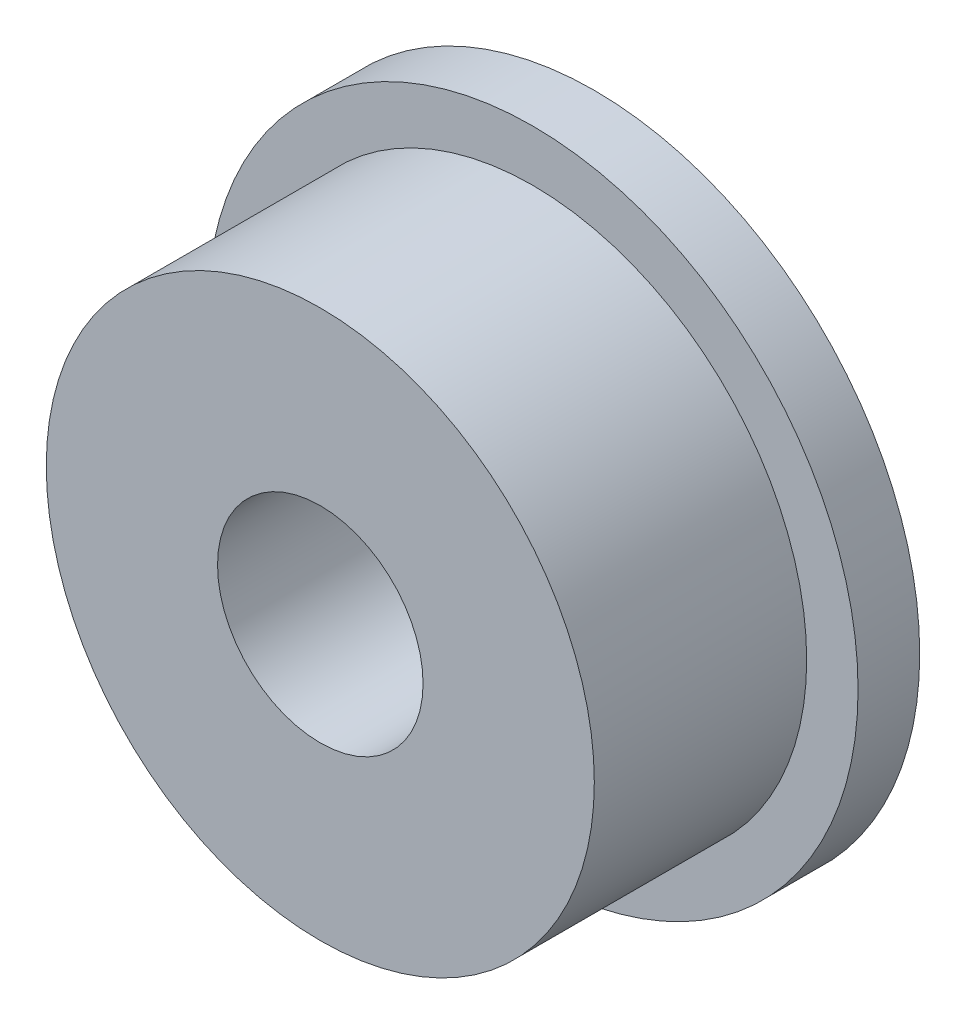
ISO-10303-21;
HEADER;
FILE_DESCRIPTION(('STEP AP214'),'2;1');
FILE_NAME('part.step','',(''),(''),'','','');
FILE_SCHEMA(('AUTOMOTIVE_DESIGN { 1 0 10303 214 1 1 1 1 }'));
ENDSEC;
DATA;
#1=APPLICATION_CONTEXT('core data for automotive mechanical design processes');
#2=APPLICATION_PROTOCOL_DEFINITION('international standard','automotive_design',2000,#1);
#3=PRODUCT_CONTEXT('',#1,'mechanical');
#4=PRODUCT('Part','Part','',(#3));
#5=PRODUCT_RELATED_PRODUCT_CATEGORY('part','',(#4));
#6=PRODUCT_DEFINITION_FORMATION('','',#4);
#7=PRODUCT_DEFINITION_CONTEXT('part definition',#1,'design');
#8=PRODUCT_DEFINITION('design','',#6,#7);
#9=PRODUCT_DEFINITION_SHAPE('','',#8);
#10=(LENGTH_UNIT() NAMED_UNIT(*) SI_UNIT(.MILLI.,.METRE.));
#11=(NAMED_UNIT(*) PLANE_ANGLE_UNIT() SI_UNIT($,.RADIAN.));
#12=(NAMED_UNIT(*) SI_UNIT($,.STERADIAN.) SOLID_ANGLE_UNIT());
#13=UNCERTAINTY_MEASURE_WITH_UNIT(LENGTH_MEASURE(1.E-05),#10,'distance_accuracy_value','');
#14=(GEOMETRIC_REPRESENTATION_CONTEXT(3) GLOBAL_UNCERTAINTY_ASSIGNED_CONTEXT((#13)) GLOBAL_UNIT_ASSIGNED_CONTEXT((#10,
#11,#12)) REPRESENTATION_CONTEXT('',''));
#15=CARTESIAN_POINT('',(0.,0.,0.));
#16=DIRECTION('',(0.,0.,1.));
#17=DIRECTION('',(1.,0.,0.));
#18=AXIS2_PLACEMENT_3D('',#15,#16,#17);
#19=CARTESIAN_POINT('',(0.,0.,1.5));
#20=DIRECTION('',(0.,0.,1.));
#21=DIRECTION('',(1.,0.,0.));
#22=AXIS2_PLACEMENT_3D('',#19,#20,#21);
#23=PLANE('',#22);
#24=CARTESIAN_POINT('',(0.,0.,1.5));
#25=DIRECTION('',(0.,0.,1.));
#26=DIRECTION('',(1.,0.,0.));
#27=AXIS2_PLACEMENT_3D('',#24,#25,#26);
#28=CIRCLE('',#27,4.);
#29=CARTESIAN_POINT('',(4.,0.,1.5));
#30=VERTEX_POINT('',#29);
#31=EDGE_CURVE('E10',#30,#30,#28,.T.);
#32=ORIENTED_EDGE('',*,*,#31,.T.);
#33=EDGE_LOOP('',(#32));
#34=FACE_BOUND('',#33,.T.);
#35=CARTESIAN_POINT('',(0.,0.,1.5));
#36=DIRECTION('',(0.,0.,1.));
#37=DIRECTION('',(1.,0.,0.));
#38=AXIS2_PLACEMENT_3D('',#35,#36,#37);
#39=CIRCLE('',#38,1.5);
#40=CARTESIAN_POINT('',(1.5,0.,1.5));
#41=VERTEX_POINT('',#40);
#42=EDGE_CURVE('E42',#41,#41,#39,.T.);
#43=ORIENTED_EDGE('',*,*,#42,.F.);
#44=EDGE_LOOP('',(#43));
#45=FACE_BOUND('',#44,.T.);
#46=ADVANCED_FACE('F40',(#34,#45),#23,.T.);
#47=CARTESIAN_POINT('',(0.,0.,-2.5));
#48=DIRECTION('',(0.,0.,1.));
#49=DIRECTION('',(1.,0.,0.));
#50=AXIS2_PLACEMENT_3D('',#47,#48,#49);
#51=PLANE('',#50);
#52=CARTESIAN_POINT('',(0.,0.,-2.5));
#53=DIRECTION('',(0.,0.,1.));
#54=DIRECTION('',(1.,0.,0.));
#55=AXIS2_PLACEMENT_3D('',#52,#53,#54);
#56=CIRCLE('',#55,1.5);
#57=CARTESIAN_POINT('',(1.5,0.,-2.5));
#58=VERTEX_POINT('',#57);
#59=EDGE_CURVE('E48',#58,#58,#56,.T.);
#60=ORIENTED_EDGE('',*,*,#59,.T.);
#61=EDGE_LOOP('',(#60));
#62=FACE_BOUND('',#61,.T.);
#63=CARTESIAN_POINT('',(0.,0.,-2.5));
#64=DIRECTION('',(0.,0.,1.));
#65=DIRECTION('',(1.,0.,0.));
#66=AXIS2_PLACEMENT_3D('',#63,#64,#65);
#67=CIRCLE('',#66,4.75);
#68=CARTESIAN_POINT('',(4.75,0.,-2.5));
#69=VERTEX_POINT('',#68);
#70=EDGE_CURVE('E59',#69,#69,#67,.T.);
#71=ORIENTED_EDGE('',*,*,#70,.F.);
#72=EDGE_LOOP('',(#71));
#73=FACE_BOUND('',#72,.T.);
#74=ADVANCED_FACE('F71',(#62,#73),#51,.F.);
#75=CARTESIAN_POINT('',(0.,0.,1.5));
#76=DIRECTION('',(0.,0.,-1.));
#77=DIRECTION('',(-1.,0.,0.));
#78=AXIS2_PLACEMENT_3D('',#75,#76,#77);
#79=CYLINDRICAL_SURFACE('',#78,4.);
#80=CARTESIAN_POINT('',(0.,0.,-1.6));
#81=DIRECTION('',(0.,0.,1.));
#82=DIRECTION('',(1.,0.,0.));
#83=AXIS2_PLACEMENT_3D('',#80,#81,#82);
#84=CIRCLE('',#83,4.);
#85=CARTESIAN_POINT('',(4.,0.,-1.6));
#86=VERTEX_POINT('',#85);
#87=EDGE_CURVE('E52',#86,#86,#84,.T.);
#88=ORIENTED_EDGE('',*,*,#87,.T.);
#89=EDGE_LOOP('',(#88));
#90=FACE_BOUND('',#89,.T.);
#91=ORIENTED_EDGE('',*,*,#31,.F.);
#92=EDGE_LOOP('',(#91));
#93=FACE_BOUND('',#92,.T.);
#94=ADVANCED_FACE('F39',(#90,#93),#79,.T.);
#95=CARTESIAN_POINT('',(0.,0.,1.5));
#96=DIRECTION('',(0.,0.,-1.));
#97=DIRECTION('',(-1.,0.,0.));
#98=AXIS2_PLACEMENT_3D('',#95,#96,#97);
#99=CYLINDRICAL_SURFACE('',#98,1.5);
#100=ORIENTED_EDGE('',*,*,#42,.T.);
#101=EDGE_LOOP('',(#100));
#102=FACE_BOUND('',#101,.T.);
#103=ORIENTED_EDGE('',*,*,#59,.F.);
#104=EDGE_LOOP('',(#103));
#105=FACE_BOUND('',#104,.T.);
#106=ADVANCED_FACE('F79',(#102,#105),#99,.F.);
#107=CARTESIAN_POINT('',(0.,0.,-1.6));
#108=DIRECTION('',(0.,0.,1.));
#109=DIRECTION('',(1.,0.,0.));
#110=AXIS2_PLACEMENT_3D('',#107,#108,#109);
#111=PLANE('',#110);
#112=CARTESIAN_POINT('',(0.,0.,-1.6));
#113=DIRECTION('',(0.,0.,1.));
#114=DIRECTION('',(1.,0.,0.));
#115=AXIS2_PLACEMENT_3D('',#112,#113,#114);
#116=CIRCLE('',#115,4.75);
#117=CARTESIAN_POINT('',(4.75,0.,-1.6));
#118=VERTEX_POINT('',#117);
#119=EDGE_CURVE('E60',#118,#118,#116,.T.);
#120=ORIENTED_EDGE('',*,*,#119,.T.);
#121=EDGE_LOOP('',(#120));
#122=FACE_BOUND('',#121,.T.);
#123=ORIENTED_EDGE('',*,*,#87,.F.);
#124=EDGE_LOOP('',(#123));
#125=FACE_BOUND('',#124,.T.);
#126=ADVANCED_FACE('F63',(#122,#125),#111,.T.);
#127=CARTESIAN_POINT('',(0.,0.,-1.6));
#128=DIRECTION('',(0.,0.,-1.));
#129=DIRECTION('',(-1.,0.,0.));
#130=AXIS2_PLACEMENT_3D('',#127,#128,#129);
#131=CYLINDRICAL_SURFACE('',#130,4.75);
#132=ORIENTED_EDGE('',*,*,#119,.F.);
#133=EDGE_LOOP('',(#132));
#134=FACE_BOUND('',#133,.T.);
#135=ORIENTED_EDGE('',*,*,#70,.T.);
#136=EDGE_LOOP('',(#135));
#137=FACE_BOUND('',#136,.T.);
#138=ADVANCED_FACE('F66',(#134,#137),#131,.T.);
#139=CLOSED_SHELL('',(#46,#74,#94,#106,#126,#138));
#140=MANIFOLD_SOLID_BREP('B2',#139);
#141=ADVANCED_BREP_SHAPE_REPRESENTATION('',(#18,#140),#14);
#142=SHAPE_DEFINITION_REPRESENTATION(#9,#141);
ENDSEC;
END-ISO-10303-21;
